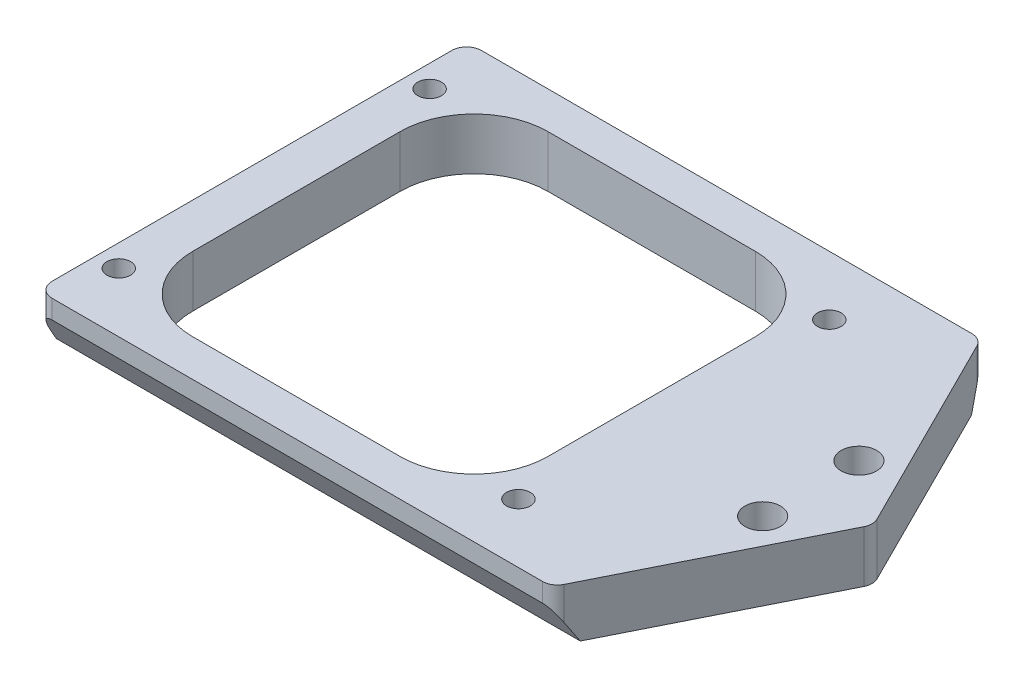
ISO-10303-21;
HEADER;
FILE_DESCRIPTION(('STEP AP214'),'2;1');
FILE_NAME('part.step','',(''),(''),'','','');
FILE_SCHEMA(('AUTOMOTIVE_DESIGN { 1 0 10303 214 1 1 1 1 }'));
ENDSEC;
DATA;
#1=APPLICATION_CONTEXT('core data for automotive mechanical design processes');
#2=APPLICATION_PROTOCOL_DEFINITION('international standard','automotive_design',2000,#1);
#3=PRODUCT_CONTEXT('',#1,'mechanical');
#4=PRODUCT('Part','Part','',(#3));
#5=PRODUCT_RELATED_PRODUCT_CATEGORY('part','',(#4));
#6=PRODUCT_DEFINITION_FORMATION('','',#4);
#7=PRODUCT_DEFINITION_CONTEXT('part definition',#1,'design');
#8=PRODUCT_DEFINITION('design','',#6,#7);
#9=PRODUCT_DEFINITION_SHAPE('','',#8);
#10=(LENGTH_UNIT() NAMED_UNIT(*) SI_UNIT(.MILLI.,.METRE.));
#11=(NAMED_UNIT(*) PLANE_ANGLE_UNIT() SI_UNIT($,.RADIAN.));
#12=(NAMED_UNIT(*) SI_UNIT($,.STERADIAN.) SOLID_ANGLE_UNIT());
#13=UNCERTAINTY_MEASURE_WITH_UNIT(LENGTH_MEASURE(1.E-05),#10,'distance_accuracy_value','');
#14=(GEOMETRIC_REPRESENTATION_CONTEXT(3) GLOBAL_UNCERTAINTY_ASSIGNED_CONTEXT((#13)) GLOBAL_UNIT_ASSIGNED_CONTEXT((#10,
#11,#12)) REPRESENTATION_CONTEXT('',''));
#15=CARTESIAN_POINT('',(0.,0.,0.));
#16=DIRECTION('',(0.,0.,1.));
#17=DIRECTION('',(1.,0.,0.));
#18=AXIS2_PLACEMENT_3D('',#15,#16,#17);
#19=CARTESIAN_POINT('',(0.,1.75,0.));
#20=DIRECTION('',(0.,-1.,0.));
#21=DIRECTION('',(0.,0.,-1.));
#22=AXIS2_PLACEMENT_3D('',#19,#20,#21);
#23=PLANE('',#22);
#24=CARTESIAN_POINT('',(37.7484344171534,1.75,-17.75));
#25=DIRECTION('',(0.,1.,0.));
#26=DIRECTION('',(0.,0.,1.));
#27=AXIS2_PLACEMENT_3D('',#24,#25,#26);
#28=CIRCLE('',#27,1.2);
#29=CARTESIAN_POINT('',(37.7484344171534,1.75,-16.55));
#30=VERTEX_POINT('',#29);
#31=EDGE_CURVE('E562',#30,#30,#28,.T.);
#32=ORIENTED_EDGE('',*,*,#31,.F.);
#33=EDGE_LOOP('',(#32));
#34=FACE_BOUND('',#33,.T.);
#35=DIRECTION('',(-1.,0.,0.));
#36=VECTOR('',#35,1.);
#37=CARTESIAN_POINT('',(0.,1.75,-29.));
#38=LINE('',#37,#36);
#39=CARTESIAN_POINT('',(34.1304601092614,1.75,-29.));
#40=VERTEX_POINT('',#39);
#41=CARTESIAN_POINT('',(1.,1.75,-29.));
#42=VERTEX_POINT('',#41);
#43=EDGE_CURVE('E219',#40,#42,#38,.T.);
#44=ORIENTED_EDGE('',*,*,#43,.T.);
#45=CARTESIAN_POINT('',(1.,1.75,-28.));
#46=DIRECTION('',(0.,-1.,0.));
#47=DIRECTION('',(0.,0.,-1.));
#48=AXIS2_PLACEMENT_3D('',#45,#46,#47);
#49=CIRCLE('',#48,1.);
#50=CARTESIAN_POINT('',(0.,1.75,-28.));
#51=VERTEX_POINT('',#50);
#52=EDGE_CURVE('E305',#42,#51,#49,.F.);
#53=ORIENTED_EDGE('',*,*,#52,.T.);
#54=DIRECTION('',(0.,0.,1.));
#55=VECTOR('',#54,1.);
#56=CARTESIAN_POINT('',(0.,1.75,0.));
#57=LINE('',#56,#55);
#58=CARTESIAN_POINT('',(0.,1.75,-1.));
#59=VERTEX_POINT('',#58);
#60=EDGE_CURVE('E224',#51,#59,#57,.T.);
#61=ORIENTED_EDGE('',*,*,#60,.T.);
#62=CARTESIAN_POINT('',(1.,1.75,-1.));
#63=DIRECTION('',(0.,-1.,0.));
#64=DIRECTION('',(0.,0.,-1.));
#65=AXIS2_PLACEMENT_3D('',#62,#63,#64);
#66=CIRCLE('',#65,1.);
#67=CARTESIAN_POINT('',(1.,1.75,0.));
#68=VERTEX_POINT('',#67);
#69=EDGE_CURVE('E293',#59,#68,#66,.F.);
#70=ORIENTED_EDGE('',*,*,#69,.T.);
#71=DIRECTION('',(1.,0.,0.));
#72=VECTOR('',#71,1.);
#73=CARTESIAN_POINT('',(0.,1.75,0.));
#74=LINE('',#73,#72);
#75=CARTESIAN_POINT('',(34.1304601092614,1.75,0.));
#76=VERTEX_POINT('',#75);
#77=EDGE_CURVE('E338',#68,#76,#74,.T.);
#78=ORIENTED_EDGE('',*,*,#77,.T.);
#79=CARTESIAN_POINT('',(34.1304601092614,1.75,-1.));
#80=DIRECTION('',(0.,-1.,0.));
#81=DIRECTION('',(0.,0.,-1.));
#82=AXIS2_PLACEMENT_3D('',#79,#80,#81);
#83=CIRCLE('',#82,1.);
#84=CARTESIAN_POINT('',(35.0248486696315,1.75,-0.552709151581289));
#85=VERTEX_POINT('',#84);
#86=EDGE_CURVE('E296',#76,#85,#83,.F.);
#87=ORIENTED_EDGE('',*,*,#86,.T.);
#88=DIRECTION('',(0.447290848418714,0.,-0.894388560370081));
#89=VECTOR('',#88,1.);
#90=CARTESIAN_POINT('',(42.,1.75,-14.5));
#91=LINE('',#90,#89);
#92=CARTESIAN_POINT('',(41.7763062812472,1.75,-14.0527091515813));
#93=VERTEX_POINT('',#92);
#94=EDGE_CURVE('E342',#85,#93,#91,.T.);
#95=ORIENTED_EDGE('',*,*,#94,.T.);
#96=CARTESIAN_POINT('',(40.8819177208771,1.75,-14.5));
#97=DIRECTION('',(0.,-1.,0.));
#98=DIRECTION('',(0.,0.,-1.));
#99=AXIS2_PLACEMENT_3D('',#96,#97,#98);
#100=CIRCLE('',#99,1.);
#101=CARTESIAN_POINT('',(41.7763062812472,1.75,-14.9472908484187));
#102=VERTEX_POINT('',#101);
#103=EDGE_CURVE('E299',#93,#102,#100,.F.);
#104=ORIENTED_EDGE('',*,*,#103,.T.);
#105=DIRECTION('',(-0.447290848418716,0.,-0.894388560370081));
#106=VECTOR('',#105,1.);
#107=CARTESIAN_POINT('',(42.,1.75,-14.5));
#108=LINE('',#107,#106);
#109=CARTESIAN_POINT('',(35.0248486696314,1.75,-28.4472908484187));
#110=VERTEX_POINT('',#109);
#111=EDGE_CURVE('E347',#102,#110,#108,.T.);
#112=ORIENTED_EDGE('',*,*,#111,.T.);
#113=CARTESIAN_POINT('',(34.1304601092614,1.75,-28.));
#114=DIRECTION('',(0.,-1.,0.));
#115=DIRECTION('',(0.,0.,-1.));
#116=AXIS2_PLACEMENT_3D('',#113,#114,#115);
#117=CIRCLE('',#116,1.);
#118=EDGE_CURVE('E302',#110,#40,#117,.F.);
#119=ORIENTED_EDGE('',*,*,#118,.T.);
#120=EDGE_LOOP('',(#44,#53,#61,#70,#78,#87,#95,#104,#112,#119));
#121=FACE_BOUND('',#120,.T.);
#122=DIRECTION('',(1.,0.,0.));
#123=VECTOR('',#122,1.);
#124=CARTESIAN_POINT('',(3.,1.75,-2.5));
#125=LINE('',#124,#123);
#126=CARTESIAN_POINT('',(8.,1.75,-2.5));
#127=VERTEX_POINT('',#126);
#128=CARTESIAN_POINT('',(22.,1.75,-2.5));
#129=VERTEX_POINT('',#128);
#130=EDGE_CURVE('E422',#127,#129,#125,.T.);
#131=ORIENTED_EDGE('',*,*,#130,.F.);
#132=CARTESIAN_POINT('',(8.,1.75,-7.5));
#133=DIRECTION('',(0.,-1.,0.));
#134=DIRECTION('',(0.,0.,-1.));
#135=AXIS2_PLACEMENT_3D('',#132,#133,#134);
#136=CIRCLE('',#135,5.);
#137=CARTESIAN_POINT('',(3.,1.75,-7.50000000000001));
#138=VERTEX_POINT('',#137);
#139=EDGE_CURVE('E271',#127,#138,#136,.T.);
#140=ORIENTED_EDGE('',*,*,#139,.T.);
#141=DIRECTION('',(0.,0.,1.));
#142=VECTOR('',#141,1.);
#143=CARTESIAN_POINT('',(3.,1.75,-26.5));
#144=LINE('',#143,#142);
#145=CARTESIAN_POINT('',(3.,1.75,-21.5));
#146=VERTEX_POINT('',#145);
#147=EDGE_CURVE('E418',#146,#138,#144,.T.);
#148=ORIENTED_EDGE('',*,*,#147,.F.);
#149=CARTESIAN_POINT('',(8.,1.75,-21.5));
#150=DIRECTION('',(0.,-1.,0.));
#151=DIRECTION('',(0.,0.,-1.));
#152=AXIS2_PLACEMENT_3D('',#149,#150,#151);
#153=CIRCLE('',#152,5.);
#154=CARTESIAN_POINT('',(8.,1.75,-26.5));
#155=VERTEX_POINT('',#154);
#156=EDGE_CURVE('E253',#146,#155,#153,.T.);
#157=ORIENTED_EDGE('',*,*,#156,.T.);
#158=DIRECTION('',(-1.,0.,0.));
#159=VECTOR('',#158,1.);
#160=CARTESIAN_POINT('',(3.,1.75,-26.5));
#161=LINE('',#160,#159);
#162=CARTESIAN_POINT('',(22.,1.75,-26.5));
#163=VERTEX_POINT('',#162);
#164=EDGE_CURVE('E430',#163,#155,#161,.T.);
#165=ORIENTED_EDGE('',*,*,#164,.F.);
#166=CARTESIAN_POINT('',(22.,1.75,-21.5));
#167=DIRECTION('',(0.,-1.,0.));
#168=DIRECTION('',(0.,0.,-1.));
#169=AXIS2_PLACEMENT_3D('',#166,#167,#168);
#170=CIRCLE('',#169,5.);
#171=CARTESIAN_POINT('',(27.,1.75,-21.5));
#172=VERTEX_POINT('',#171);
#173=EDGE_CURVE('E259',#163,#172,#170,.T.);
#174=ORIENTED_EDGE('',*,*,#173,.T.);
#175=DIRECTION('',(0.,0.,-1.));
#176=VECTOR('',#175,1.);
#177=CARTESIAN_POINT('',(27.,1.75,-26.5));
#178=LINE('',#177,#176);
#179=CARTESIAN_POINT('',(27.,1.75,-7.50000000000001));
#180=VERTEX_POINT('',#179);
#181=EDGE_CURVE('E426',#180,#172,#178,.T.);
#182=ORIENTED_EDGE('',*,*,#181,.F.);
#183=CARTESIAN_POINT('',(22.,1.75,-7.5));
#184=DIRECTION('',(0.,-1.,0.));
#185=DIRECTION('',(0.,0.,-1.));
#186=AXIS2_PLACEMENT_3D('',#183,#184,#185);
#187=CIRCLE('',#186,5.);
#188=EDGE_CURVE('E265',#180,#129,#187,.T.);
#189=ORIENTED_EDGE('',*,*,#188,.T.);
#190=EDGE_LOOP('',(#131,#140,#148,#157,#165,#174,#182,#189));
#191=FACE_BOUND('',#190,.T.);
#192=CARTESIAN_POINT('',(1.5,1.75,-4.));
#193=DIRECTION('',(0.,1.,0.));
#194=DIRECTION('',(0.,0.,1.));
#195=AXIS2_PLACEMENT_3D('',#192,#193,#194);
#196=CIRCLE('',#195,0.799999999999988);
#197=CARTESIAN_POINT('',(1.5,1.75,-3.20000000000002));
#198=VERTEX_POINT('',#197);
#199=EDGE_CURVE('E410',#198,#198,#196,.T.);
#200=ORIENTED_EDGE('',*,*,#199,.F.);
#201=EDGE_LOOP('',(#200));
#202=FACE_BOUND('',#201,.T.);
#203=CARTESIAN_POINT('',(28.5,1.75,-4.00000000000001));
#204=DIRECTION('',(0.,1.,0.));
#205=DIRECTION('',(0.,0.,1.));
#206=AXIS2_PLACEMENT_3D('',#203,#204,#205);
#207=CIRCLE('',#206,0.799999999999988);
#208=CARTESIAN_POINT('',(28.5,1.75,-3.20000000000002));
#209=VERTEX_POINT('',#208);
#210=EDGE_CURVE('E402',#209,#209,#207,.T.);
#211=ORIENTED_EDGE('',*,*,#210,.F.);
#212=EDGE_LOOP('',(#211));
#213=FACE_BOUND('',#212,.T.);
#214=CARTESIAN_POINT('',(28.5,1.75,-25.));
#215=DIRECTION('',(0.,1.,0.));
#216=DIRECTION('',(0.,0.,1.));
#217=AXIS2_PLACEMENT_3D('',#214,#215,#216);
#218=CIRCLE('',#217,0.799999999999988);
#219=CARTESIAN_POINT('',(28.5,1.75,-24.2));
#220=VERTEX_POINT('',#219);
#221=EDGE_CURVE('E394',#220,#220,#218,.T.);
#222=ORIENTED_EDGE('',*,*,#221,.F.);
#223=EDGE_LOOP('',(#222));
#224=FACE_BOUND('',#223,.T.);
#225=CARTESIAN_POINT('',(1.5,1.75,-25.));
#226=DIRECTION('',(0.,1.,0.));
#227=DIRECTION('',(0.,0.,1.));
#228=AXIS2_PLACEMENT_3D('',#225,#226,#227);
#229=CIRCLE('',#228,0.799999999999988);
#230=CARTESIAN_POINT('',(1.5,1.75,-24.2));
#231=VERTEX_POINT('',#230);
#232=EDGE_CURVE('E386',#231,#231,#229,.T.);
#233=ORIENTED_EDGE('',*,*,#232,.F.);
#234=EDGE_LOOP('',(#233));
#235=FACE_BOUND('',#234,.T.);
#236=CARTESIAN_POINT('',(37.7484344171534,1.75,-11.25));
#237=DIRECTION('',(0.,1.,0.));
#238=DIRECTION('',(0.,0.,1.));
#239=AXIS2_PLACEMENT_3D('',#236,#237,#238);
#240=CIRCLE('',#239,1.2);
#241=CARTESIAN_POINT('',(37.7484344171534,1.75,-10.05));
#242=VERTEX_POINT('',#241);
#243=EDGE_CURVE('E554',#242,#242,#240,.T.);
#244=ORIENTED_EDGE('',*,*,#243,.F.);
#245=EDGE_LOOP('',(#244));
#246=FACE_BOUND('',#245,.T.);
#247=ADVANCED_FACE('F43',(#34,#121,#191,#202,#213,#224,#235,#246),#23,.F.);
#248=CARTESIAN_POINT('',(0.,1.75,0.));
#249=DIRECTION('',(1.,0.,0.));
#250=DIRECTION('',(0.,0.,-1.));
#251=AXIS2_PLACEMENT_3D('',#248,#249,#250);
#252=PLANE('',#251);
#253=DIRECTION('',(0.,-0.866025403784436,0.500000000000005));
#254=VECTOR('',#253,1.);
#255=CARTESIAN_POINT('',(0.,-1.75000000000018,-27.7128129211089));
#256=LINE('',#255,#254);
#257=CARTESIAN_POINT('',(0.,-1.25257738808342,-28.));
#258=VERTEX_POINT('',#257);
#259=CARTESIAN_POINT('',(0.,-1.75000000000018,-27.7128129211089));
#260=VERTEX_POINT('',#259);
#261=EDGE_CURVE('E181',#258,#260,#256,.T.);
#262=ORIENTED_EDGE('',*,*,#261,.T.);
#263=DIRECTION('',(0.,0.,1.));
#264=VECTOR('',#263,1.);
#265=CARTESIAN_POINT('',(0.,-1.75,0.));
#266=LINE('',#265,#264);
#267=CARTESIAN_POINT('',(0.,-1.75000000000018,-1.28718707889115));
#268=VERTEX_POINT('',#267);
#269=EDGE_CURVE('E196',#260,#268,#266,.T.);
#270=ORIENTED_EDGE('',*,*,#269,.T.);
#271=DIRECTION('',(0.,-0.866025403784436,-0.500000000000005));
#272=VECTOR('',#271,1.);
#273=CARTESIAN_POINT('',(0.,-1.75000000000018,-1.28718707889115));
#274=LINE('',#273,#272);
#275=CARTESIAN_POINT('',(0.,-1.25257738808342,-1.));
#276=VERTEX_POINT('',#275);
#277=EDGE_CURVE('E367',#276,#268,#274,.T.);
#278=ORIENTED_EDGE('',*,*,#277,.F.);
#279=DIRECTION('',(0.,-1.,0.));
#280=VECTOR('',#279,1.);
#281=CARTESIAN_POINT('',(0.,1.75,-1.));
#282=LINE('',#281,#280);
#283=EDGE_CURVE('E277',#276,#59,#282,.F.);
#284=ORIENTED_EDGE('',*,*,#283,.T.);
#285=ORIENTED_EDGE('',*,*,#60,.F.);
#286=DIRECTION('',(0.,-1.,0.));
#287=VECTOR('',#286,1.);
#288=CARTESIAN_POINT('',(0.,1.75,-28.));
#289=LINE('',#288,#287);
#290=EDGE_CURVE('E200',#51,#258,#289,.T.);
#291=ORIENTED_EDGE('',*,*,#290,.T.);
#292=EDGE_LOOP('',(#262,#270,#278,#284,#285,#291));
#293=FACE_BOUND('',#292,.T.);
#294=ADVANCED_FACE('F194',(#293),#252,.F.);
#295=CARTESIAN_POINT('',(0.,-1.75,0.));
#296=DIRECTION('',(0.,-1.,0.));
#297=DIRECTION('',(0.,0.,-1.));
#298=AXIS2_PLACEMENT_3D('',#295,#296,#297);
#299=PLANE('',#298);
#300=CARTESIAN_POINT('',(37.7484344171534,-1.75000000000018,-17.75));
#301=DIRECTION('',(0.,1.,0.));
#302=DIRECTION('',(0.,0.,1.));
#303=AXIS2_PLACEMENT_3D('',#300,#301,#302);
#304=CIRCLE('',#303,1.2);
#305=CARTESIAN_POINT('',(37.7484344171534,-1.75000000000018,-16.55));
#306=VERTEX_POINT('',#305);
#307=EDGE_CURVE('E558',#306,#306,#304,.T.);
#308=ORIENTED_EDGE('',*,*,#307,.T.);
#309=EDGE_LOOP('',(#308));
#310=FACE_BOUND('',#309,.T.);
#311=CARTESIAN_POINT('',(37.7484344171534,-1.75000000000018,-11.25));
#312=DIRECTION('',(0.,1.,0.));
#313=DIRECTION('',(0.,0.,1.));
#314=AXIS2_PLACEMENT_3D('',#311,#312,#313);
#315=CIRCLE('',#314,1.2);
#316=CARTESIAN_POINT('',(37.7484344171534,-1.75000000000018,-10.05));
#317=VERTEX_POINT('',#316);
#318=EDGE_CURVE('E190',#317,#317,#315,.T.);
#319=ORIENTED_EDGE('',*,*,#318,.T.);
#320=EDGE_LOOP('',(#319));
#321=FACE_BOUND('',#320,.T.);
#322=CARTESIAN_POINT('',(1.5,-1.75,-25.));
#323=DIRECTION('',(0.,1.,0.));
#324=DIRECTION('',(0.,0.,1.));
#325=AXIS2_PLACEMENT_3D('',#322,#323,#324);
#326=CIRCLE('',#325,0.799999999999999);
#327=CARTESIAN_POINT('',(1.5,-1.75,-24.2));
#328=VERTEX_POINT('',#327);
#329=EDGE_CURVE('E390',#328,#328,#326,.T.);
#330=ORIENTED_EDGE('',*,*,#329,.T.);
#331=EDGE_LOOP('',(#330));
#332=FACE_BOUND('',#331,.T.);
#333=CARTESIAN_POINT('',(28.5,-1.75,-25.));
#334=DIRECTION('',(0.,1.,0.));
#335=DIRECTION('',(0.,0.,1.));
#336=AXIS2_PLACEMENT_3D('',#333,#334,#335);
#337=CIRCLE('',#336,0.799999999999999);
#338=CARTESIAN_POINT('',(28.5,-1.75,-24.2));
#339=VERTEX_POINT('',#338);
#340=EDGE_CURVE('E398',#339,#339,#337,.T.);
#341=ORIENTED_EDGE('',*,*,#340,.T.);
#342=EDGE_LOOP('',(#341));
#343=FACE_BOUND('',#342,.T.);
#344=CARTESIAN_POINT('',(28.5,-1.75,-4.00000000000001));
#345=DIRECTION('',(0.,1.,0.));
#346=DIRECTION('',(0.,0.,1.));
#347=AXIS2_PLACEMENT_3D('',#344,#345,#346);
#348=CIRCLE('',#347,0.799999999999999);
#349=CARTESIAN_POINT('',(28.5,-1.75,-3.20000000000001));
#350=VERTEX_POINT('',#349);
#351=EDGE_CURVE('E406',#350,#350,#348,.T.);
#352=ORIENTED_EDGE('',*,*,#351,.T.);
#353=EDGE_LOOP('',(#352));
#354=FACE_BOUND('',#353,.T.);
#355=CARTESIAN_POINT('',(1.5,-1.75,-4.));
#356=DIRECTION('',(0.,1.,0.));
#357=DIRECTION('',(0.,0.,1.));
#358=AXIS2_PLACEMENT_3D('',#355,#356,#357);
#359=CIRCLE('',#358,0.799999999999999);
#360=CARTESIAN_POINT('',(1.5,-1.75,-3.20000000000001));
#361=VERTEX_POINT('',#360);
#362=EDGE_CURVE('E414',#361,#361,#359,.T.);
#363=ORIENTED_EDGE('',*,*,#362,.T.);
#364=EDGE_LOOP('',(#363));
#365=FACE_BOUND('',#364,.T.);
#366=DIRECTION('',(-1.,0.,0.));
#367=VECTOR('',#366,1.);
#368=CARTESIAN_POINT('',(3.,-1.75,-26.5));
#369=LINE('',#368,#367);
#370=CARTESIAN_POINT('',(22.,-1.75,-26.5));
#371=VERTEX_POINT('',#370);
#372=CARTESIAN_POINT('',(8.,-1.75,-26.5));
#373=VERTEX_POINT('',#372);
#374=EDGE_CURVE('E209',#371,#373,#369,.T.);
#375=ORIENTED_EDGE('',*,*,#374,.T.);
#376=CARTESIAN_POINT('',(8.,-1.75,-21.5));
#377=DIRECTION('',(0.,-1.,0.));
#378=DIRECTION('',(0.,0.,-1.));
#379=AXIS2_PLACEMENT_3D('',#376,#377,#378);
#380=CIRCLE('',#379,5.);
#381=CARTESIAN_POINT('',(3.,-1.75,-21.5));
#382=VERTEX_POINT('',#381);
#383=EDGE_CURVE('E256',#373,#382,#380,.F.);
#384=ORIENTED_EDGE('',*,*,#383,.T.);
#385=DIRECTION('',(0.,0.,1.));
#386=VECTOR('',#385,1.);
#387=CARTESIAN_POINT('',(3.,-1.75,-26.5));
#388=LINE('',#387,#386);
#389=CARTESIAN_POINT('',(3.,-1.75,-7.50000000000001));
#390=VERTEX_POINT('',#389);
#391=EDGE_CURVE('E434',#382,#390,#388,.T.);
#392=ORIENTED_EDGE('',*,*,#391,.T.);
#393=CARTESIAN_POINT('',(8.,-1.75,-7.5));
#394=DIRECTION('',(0.,-1.,0.));
#395=DIRECTION('',(0.,0.,-1.));
#396=AXIS2_PLACEMENT_3D('',#393,#394,#395);
#397=CIRCLE('',#396,5.);
#398=CARTESIAN_POINT('',(8.,-1.75,-2.5));
#399=VERTEX_POINT('',#398);
#400=EDGE_CURVE('E274',#390,#399,#397,.F.);
#401=ORIENTED_EDGE('',*,*,#400,.T.);
#402=DIRECTION('',(1.,0.,0.));
#403=VECTOR('',#402,1.);
#404=CARTESIAN_POINT('',(3.,-1.75,-2.5));
#405=LINE('',#404,#403);
#406=CARTESIAN_POINT('',(22.,-1.75,-2.5));
#407=VERTEX_POINT('',#406);
#408=EDGE_CURVE('E438',#399,#407,#405,.T.);
#409=ORIENTED_EDGE('',*,*,#408,.T.);
#410=CARTESIAN_POINT('',(22.,-1.75,-7.5));
#411=DIRECTION('',(0.,-1.,0.));
#412=DIRECTION('',(0.,0.,-1.));
#413=AXIS2_PLACEMENT_3D('',#410,#411,#412);
#414=CIRCLE('',#413,5.);
#415=CARTESIAN_POINT('',(27.,-1.75,-7.50000000000001));
#416=VERTEX_POINT('',#415);
#417=EDGE_CURVE('E268',#407,#416,#414,.F.);
#418=ORIENTED_EDGE('',*,*,#417,.T.);
#419=DIRECTION('',(0.,0.,-1.));
#420=VECTOR('',#419,1.);
#421=CARTESIAN_POINT('',(27.,-1.75,-26.5));
#422=LINE('',#421,#420);
#423=CARTESIAN_POINT('',(27.,-1.75,-21.5));
#424=VERTEX_POINT('',#423);
#425=EDGE_CURVE('E216',#416,#424,#422,.T.);
#426=ORIENTED_EDGE('',*,*,#425,.T.);
#427=CARTESIAN_POINT('',(22.,-1.75,-21.5));
#428=DIRECTION('',(0.,-1.,0.));
#429=DIRECTION('',(0.,0.,-1.));
#430=AXIS2_PLACEMENT_3D('',#427,#428,#429);
#431=CIRCLE('',#430,5.);
#432=EDGE_CURVE('E262',#424,#371,#431,.F.);
#433=ORIENTED_EDGE('',*,*,#432,.T.);
#434=EDGE_LOOP('',(#375,#384,#392,#401,#409,#418,#426,#433));
#435=FACE_BOUND('',#434,.T.);
#436=ORIENTED_EDGE('',*,*,#269,.F.);
#437=DIRECTION('',(1.,0.,0.));
#438=VECTOR('',#437,1.);
#439=CARTESIAN_POINT('',(39.1539644536348,-1.75,-27.7128129211085));
#440=LINE('',#439,#438);
#441=CARTESIAN_POINT('',(35.3921669357723,-1.75000000000002,-27.7128129211086));
#442=VERTEX_POINT('',#441);
#443=EDGE_CURVE('E178',#260,#442,#440,.T.);
#444=ORIENTED_EDGE('',*,*,#443,.T.);
#445=DIRECTION('',(-0.447290848418716,0.,-0.894388560370081));
#446=VECTOR('',#445,1.);
#447=CARTESIAN_POINT('',(42.,-1.75,-14.5));
#448=LINE('',#447,#446);
#449=CARTESIAN_POINT('',(41.7763062812472,-1.75,-14.9472908484187));
#450=VERTEX_POINT('',#449);
#451=EDGE_CURVE('E213',#450,#442,#448,.T.);
#452=ORIENTED_EDGE('',*,*,#451,.F.);
#453=CARTESIAN_POINT('',(40.8819177208771,-1.75,-14.5));
#454=DIRECTION('',(0.,-1.,0.));
#455=DIRECTION('',(0.,0.,-1.));
#456=AXIS2_PLACEMENT_3D('',#453,#454,#455);
#457=CIRCLE('',#456,1.);
#458=CARTESIAN_POINT('',(41.7763062812472,-1.75,-14.0527091515813));
#459=VERTEX_POINT('',#458);
#460=EDGE_CURVE('E282',#450,#459,#457,.T.);
#461=ORIENTED_EDGE('',*,*,#460,.T.);
#462=DIRECTION('',(0.447290848418714,0.,-0.894388560370081));
#463=VECTOR('',#462,1.);
#464=CARTESIAN_POINT('',(42.,-1.75,-14.5));
#465=LINE('',#464,#463);
#466=CARTESIAN_POINT('',(35.3921669357723,-1.75000000000002,-1.28718707889143));
#467=VERTEX_POINT('',#466);
#468=EDGE_CURVE('E208',#467,#459,#465,.T.);
#469=ORIENTED_EDGE('',*,*,#468,.F.);
#470=DIRECTION('',(1.,0.,0.));
#471=VECTOR('',#470,1.);
#472=CARTESIAN_POINT('',(39.1539644536348,-1.75,-1.28718707889146));
#473=LINE('',#472,#471);
#474=EDGE_CURVE('E206',#268,#467,#473,.T.);
#475=ORIENTED_EDGE('',*,*,#474,.F.);
#476=EDGE_LOOP('',(#436,#444,#452,#461,#469,#475));
#477=FACE_BOUND('',#476,.T.);
#478=ADVANCED_FACE('F204',(#310,#321,#332,#343,#354,#365,#435,#477),#299,.T.);
#479=CARTESIAN_POINT('',(42.,1.75,-14.5));
#480=DIRECTION('',(-0.894388560370081,0.,0.447290848418716));
#481=DIRECTION('',(0.447290848418716,0.,0.894388560370081));
#482=AXIS2_PLACEMENT_3D('',#479,#480,#481);
#483=PLANE('',#482);
#484=DIRECTION('',(0.242584917028739,-0.840157377235131,0.485065087908361));
#485=VECTOR('',#484,1.);
#486=CARTESIAN_POINT('',(36.6224324796576,-6.01084476031521,-25.2528130517653));
#487=LINE('',#486,#485);
#488=CARTESIAN_POINT('',(35.0248486696314,-0.477846912860995,-28.4472908484187));
#489=VERTEX_POINT('',#488);
#490=EDGE_CURVE('E184',#489,#442,#487,.T.);
#491=ORIENTED_EDGE('',*,*,#490,.F.);
#492=DIRECTION('',(0.,-1.,0.));
#493=VECTOR('',#492,1.);
#494=CARTESIAN_POINT('',(35.0248486696314,1.75,-28.4472908484187));
#495=LINE('',#494,#493);
#496=EDGE_CURVE('E312',#489,#110,#495,.F.);
#497=ORIENTED_EDGE('',*,*,#496,.T.);
#498=ORIENTED_EDGE('',*,*,#111,.F.);
#499=DIRECTION('',(0.,-1.,0.));
#500=VECTOR('',#499,1.);
#501=CARTESIAN_POINT('',(41.7763062812472,1.75,-14.9472908484187));
#502=LINE('',#501,#500);
#503=EDGE_CURVE('E308',#102,#450,#502,.T.);
#504=ORIENTED_EDGE('',*,*,#503,.T.);
#505=ORIENTED_EDGE('',*,*,#451,.T.);
#506=EDGE_LOOP('',(#491,#497,#498,#504,#505));
#507=FACE_BOUND('',#506,.T.);
#508=ADVANCED_FACE('F502',(#507),#483,.F.);
#509=CARTESIAN_POINT('',(0.,1.75,-29.));
#510=DIRECTION('',(0.,0.,1.));
#511=DIRECTION('',(1.,0.,0.));
#512=AXIS2_PLACEMENT_3D('',#509,#510,#511);
#513=PLANE('',#512);
#514=DIRECTION('',(1.,0.,0.));
#515=VECTOR('',#514,1.);
#516=CARTESIAN_POINT('',(0.,0.479473419485434,-29.));
#517=LINE('',#516,#515);
#518=CARTESIAN_POINT('',(1.,0.479473419485452,-29.));
#519=VERTEX_POINT('',#518);
#520=CARTESIAN_POINT('',(34.1304601092614,0.479473419486056,-29.));
#521=VERTEX_POINT('',#520);
#522=EDGE_CURVE('E59',#519,#521,#517,.T.);
#523=ORIENTED_EDGE('',*,*,#522,.F.);
#524=DIRECTION('',(0.,-1.,0.));
#525=VECTOR('',#524,1.);
#526=CARTESIAN_POINT('',(1.,1.75,-29.));
#527=LINE('',#526,#525);
#528=EDGE_CURVE('E290',#519,#42,#527,.F.);
#529=ORIENTED_EDGE('',*,*,#528,.T.);
#530=ORIENTED_EDGE('',*,*,#43,.F.);
#531=DIRECTION('',(0.,-1.,0.));
#532=VECTOR('',#531,1.);
#533=CARTESIAN_POINT('',(34.1304601092614,1.75,-29.));
#534=LINE('',#533,#532);
#535=EDGE_CURVE('E286',#40,#521,#534,.T.);
#536=ORIENTED_EDGE('',*,*,#535,.T.);
#537=EDGE_LOOP('',(#523,#529,#530,#536));
#538=FACE_BOUND('',#537,.T.);
#539=ADVANCED_FACE('F504',(#538),#513,.F.);
#540=CARTESIAN_POINT('',(1.,1.75,-28.));
#541=DIRECTION('',(0.,-1.,0.));
#542=DIRECTION('',(0.,0.,-1.));
#543=AXIS2_PLACEMENT_3D('',#540,#541,#542);
#544=CYLINDRICAL_SURFACE('',#543,1.);
#545=ORIENTED_EDGE('',*,*,#528,.F.);
#546=CARTESIAN_POINT('',(1.,-1.25257738808341,-28.));
#547=DIRECTION('',(0.,-0.500000000000005,-0.866025403784436));
#548=DIRECTION('',(0.,-0.866025403784436,0.500000000000005));
#549=AXIS2_PLACEMENT_3D('',#546,#547,#548);
#550=ELLIPSE('',#549,1.99999999999998,1.);
#551=EDGE_CURVE('E365',#519,#258,#550,.F.);
#552=ORIENTED_EDGE('',*,*,#551,.T.);
#553=ORIENTED_EDGE('',*,*,#290,.F.);
#554=ORIENTED_EDGE('',*,*,#52,.F.);
#555=EDGE_LOOP('',(#545,#552,#553,#554));
#556=FACE_BOUND('',#555,.T.);
#557=ADVANCED_FACE('F364',(#556),#544,.T.);
#558=CARTESIAN_POINT('',(34.1304601092614,1.75,-28.));
#559=DIRECTION('',(0.,-1.,0.));
#560=DIRECTION('',(0.,0.,-1.));
#561=AXIS2_PLACEMENT_3D('',#558,#559,#560);
#562=CYLINDRICAL_SURFACE('',#561,1.);
#563=ORIENTED_EDGE('',*,*,#496,.F.);
#564=CARTESIAN_POINT('',(34.1304601092614,-1.2525773880828,-28.));
#565=DIRECTION('',(0.,-0.500000000000005,-0.866025403784436));
#566=DIRECTION('',(0.,-0.866025403784436,0.500000000000005));
#567=AXIS2_PLACEMENT_3D('',#564,#565,#566);
#568=ELLIPSE('',#567,1.99999999999998,1.);
#569=EDGE_CURVE('E11',#489,#521,#568,.F.);
#570=ORIENTED_EDGE('',*,*,#569,.T.);
#571=ORIENTED_EDGE('',*,*,#535,.F.);
#572=ORIENTED_EDGE('',*,*,#118,.F.);
#573=EDGE_LOOP('',(#563,#570,#571,#572));
#574=FACE_BOUND('',#573,.T.);
#575=ADVANCED_FACE('F516',(#574),#562,.T.);
#576=CARTESIAN_POINT('',(0.,1.75,0.));
#577=DIRECTION('',(0.,0.,-1.));
#578=DIRECTION('',(-1.,0.,0.));
#579=AXIS2_PLACEMENT_3D('',#576,#577,#578);
#580=PLANE('',#579);
#581=DIRECTION('',(-1.,0.,0.));
#582=VECTOR('',#581,1.);
#583=CARTESIAN_POINT('',(0.,0.479473419485436,0.));
#584=LINE('',#583,#582);
#585=CARTESIAN_POINT('',(34.1304601092614,0.479473419486058,0.));
#586=VERTEX_POINT('',#585);
#587=CARTESIAN_POINT('',(1.,0.479473419485455,0.));
#588=VERTEX_POINT('',#587);
#589=EDGE_CURVE('E66',#586,#588,#584,.T.);
#590=ORIENTED_EDGE('',*,*,#589,.F.);
#591=DIRECTION('',(0.,-1.,0.));
#592=VECTOR('',#591,1.);
#593=CARTESIAN_POINT('',(34.1304601092614,1.75,0.));
#594=LINE('',#593,#592);
#595=EDGE_CURVE('E326',#586,#76,#594,.F.);
#596=ORIENTED_EDGE('',*,*,#595,.T.);
#597=ORIENTED_EDGE('',*,*,#77,.F.);
#598=DIRECTION('',(0.,-1.,0.));
#599=VECTOR('',#598,1.);
#600=CARTESIAN_POINT('',(1.,1.75,0.));
#601=LINE('',#600,#599);
#602=EDGE_CURVE('E322',#68,#588,#601,.T.);
#603=ORIENTED_EDGE('',*,*,#602,.T.);
#604=EDGE_LOOP('',(#590,#596,#597,#603));
#605=FACE_BOUND('',#604,.T.);
#606=ADVANCED_FACE('F335',(#605),#580,.F.);
#607=CARTESIAN_POINT('',(42.,1.75,-14.5));
#608=DIRECTION('',(-0.894388560370081,0.,-0.447290848418714));
#609=DIRECTION('',(-0.447290848418714,0.,0.894388560370082));
#610=AXIS2_PLACEMENT_3D('',#607,#608,#609);
#611=PLANE('',#610);
#612=DIRECTION('',(-0.242584917028739,0.840157377235131,0.485065087908361));
#613=VECTOR('',#612,1.);
#614=CARTESIAN_POINT('',(36.6224324796576,-6.01084476031521,-3.74718694823466));
#615=LINE('',#614,#613);
#616=CARTESIAN_POINT('',(35.0248486696315,-0.477846912860995,-0.552709151581289));
#617=VERTEX_POINT('',#616);
#618=EDGE_CURVE('E383',#467,#617,#615,.T.);
#619=ORIENTED_EDGE('',*,*,#618,.F.);
#620=ORIENTED_EDGE('',*,*,#468,.T.);
#621=DIRECTION('',(0.,-1.,0.));
#622=VECTOR('',#621,1.);
#623=CARTESIAN_POINT('',(41.7763062812472,1.75,-14.0527091515813));
#624=LINE('',#623,#622);
#625=EDGE_CURVE('E319',#459,#93,#624,.F.);
#626=ORIENTED_EDGE('',*,*,#625,.T.);
#627=ORIENTED_EDGE('',*,*,#94,.F.);
#628=DIRECTION('',(0.,-1.,0.));
#629=VECTOR('',#628,1.);
#630=CARTESIAN_POINT('',(35.0248486696315,1.75,-0.552709151581289));
#631=LINE('',#630,#629);
#632=EDGE_CURVE('E315',#85,#617,#631,.T.);
#633=ORIENTED_EDGE('',*,*,#632,.T.);
#634=EDGE_LOOP('',(#619,#620,#626,#627,#633));
#635=FACE_BOUND('',#634,.T.);
#636=ADVANCED_FACE('F510',(#635),#611,.F.);
#637=CARTESIAN_POINT('',(34.1304601092614,1.75,-1.));
#638=DIRECTION('',(0.,-1.,0.));
#639=DIRECTION('',(0.,0.,-1.));
#640=AXIS2_PLACEMENT_3D('',#637,#638,#639);
#641=CYLINDRICAL_SURFACE('',#640,1.);
#642=ORIENTED_EDGE('',*,*,#595,.F.);
#643=CARTESIAN_POINT('',(34.1304601092614,-1.2525773880828,-1.));
#644=DIRECTION('',(0.,-0.500000000000005,0.866025403784436));
#645=DIRECTION('',(0.,-0.866025403784436,-0.500000000000005));
#646=AXIS2_PLACEMENT_3D('',#643,#644,#645);
#647=ELLIPSE('',#646,1.99999999999998,1.);
#648=EDGE_CURVE('E379',#586,#617,#647,.F.);
#649=ORIENTED_EDGE('',*,*,#648,.T.);
#650=ORIENTED_EDGE('',*,*,#632,.F.);
#651=ORIENTED_EDGE('',*,*,#86,.F.);
#652=EDGE_LOOP('',(#642,#649,#650,#651));
#653=FACE_BOUND('',#652,.T.);
#654=ADVANCED_FACE('F513',(#653),#641,.T.);
#655=CARTESIAN_POINT('',(1.,1.75,-1.));
#656=DIRECTION('',(0.,-1.,0.));
#657=DIRECTION('',(0.,0.,-1.));
#658=AXIS2_PLACEMENT_3D('',#655,#656,#657);
#659=CYLINDRICAL_SURFACE('',#658,1.);
#660=ORIENTED_EDGE('',*,*,#283,.F.);
#661=CARTESIAN_POINT('',(1.,-1.2525773880834,-1.));
#662=DIRECTION('',(0.,-0.500000000000005,0.866025403784436));
#663=DIRECTION('',(0.,-0.866025403784436,-0.500000000000005));
#664=AXIS2_PLACEMENT_3D('',#661,#662,#663);
#665=ELLIPSE('',#664,1.99999999999998,1.);
#666=EDGE_CURVE('E52',#276,#588,#665,.F.);
#667=ORIENTED_EDGE('',*,*,#666,.T.);
#668=ORIENTED_EDGE('',*,*,#602,.F.);
#669=ORIENTED_EDGE('',*,*,#69,.F.);
#670=EDGE_LOOP('',(#660,#667,#668,#669));
#671=FACE_BOUND('',#670,.T.);
#672=ADVANCED_FACE('F45',(#671),#659,.T.);
#673=CARTESIAN_POINT('',(3.,-1.75,-26.5));
#674=DIRECTION('',(-1.,0.,0.));
#675=DIRECTION('',(0.,0.,1.));
#676=AXIS2_PLACEMENT_3D('',#673,#674,#675);
#677=PLANE('',#676);
#678=ORIENTED_EDGE('',*,*,#391,.F.);
#679=DIRECTION('',(0.,1.,0.));
#680=VECTOR('',#679,1.);
#681=CARTESIAN_POINT('',(3.,1.75,-21.5));
#682=LINE('',#681,#680);
#683=EDGE_CURVE('E228',#382,#146,#682,.T.);
#684=ORIENTED_EDGE('',*,*,#683,.T.);
#685=ORIENTED_EDGE('',*,*,#147,.T.);
#686=DIRECTION('',(0.,1.,0.));
#687=VECTOR('',#686,1.);
#688=CARTESIAN_POINT('',(3.,-1.75,-7.5));
#689=LINE('',#688,#687);
#690=EDGE_CURVE('E225',#138,#390,#689,.F.);
#691=ORIENTED_EDGE('',*,*,#690,.T.);
#692=EDGE_LOOP('',(#678,#684,#685,#691));
#693=FACE_BOUND('',#692,.T.);
#694=ADVANCED_FACE('F469',(#693),#677,.F.);
#695=CARTESIAN_POINT('',(3.,-1.75,-26.5));
#696=DIRECTION('',(0.,0.,-1.));
#697=DIRECTION('',(-1.,0.,0.));
#698=AXIS2_PLACEMENT_3D('',#695,#696,#697);
#699=PLANE('',#698);
#700=ORIENTED_EDGE('',*,*,#164,.T.);
#701=DIRECTION('',(0.,1.,0.));
#702=VECTOR('',#701,1.);
#703=CARTESIAN_POINT('',(8.,-1.75,-26.5));
#704=LINE('',#703,#702);
#705=EDGE_CURVE('E236',#155,#373,#704,.F.);
#706=ORIENTED_EDGE('',*,*,#705,.T.);
#707=ORIENTED_EDGE('',*,*,#374,.F.);
#708=DIRECTION('',(0.,1.,0.));
#709=VECTOR('',#708,1.);
#710=CARTESIAN_POINT('',(22.,1.75,-26.5));
#711=LINE('',#710,#709);
#712=EDGE_CURVE('E232',#371,#163,#711,.T.);
#713=ORIENTED_EDGE('',*,*,#712,.T.);
#714=EDGE_LOOP('',(#700,#706,#707,#713));
#715=FACE_BOUND('',#714,.T.);
#716=ADVANCED_FACE('F457',(#715),#699,.F.);
#717=CARTESIAN_POINT('',(27.,-1.75,-26.5));
#718=DIRECTION('',(1.,0.,0.));
#719=DIRECTION('',(0.,0.,-1.));
#720=AXIS2_PLACEMENT_3D('',#717,#718,#719);
#721=PLANE('',#720);
#722=ORIENTED_EDGE('',*,*,#181,.T.);
#723=DIRECTION('',(0.,1.,0.));
#724=VECTOR('',#723,1.);
#725=CARTESIAN_POINT('',(27.,-1.75,-21.5));
#726=LINE('',#725,#724);
#727=EDGE_CURVE('E243',#172,#424,#726,.F.);
#728=ORIENTED_EDGE('',*,*,#727,.T.);
#729=ORIENTED_EDGE('',*,*,#425,.F.);
#730=DIRECTION('',(0.,1.,0.));
#731=VECTOR('',#730,1.);
#732=CARTESIAN_POINT('',(27.,1.75,-7.5));
#733=LINE('',#732,#731);
#734=EDGE_CURVE('E239',#416,#180,#733,.T.);
#735=ORIENTED_EDGE('',*,*,#734,.T.);
#736=EDGE_LOOP('',(#722,#728,#729,#735));
#737=FACE_BOUND('',#736,.T.);
#738=ADVANCED_FACE('F481',(#737),#721,.F.);
#739=CARTESIAN_POINT('',(3.,-1.75,-2.5));
#740=DIRECTION('',(0.,0.,1.));
#741=DIRECTION('',(1.,0.,0.));
#742=AXIS2_PLACEMENT_3D('',#739,#740,#741);
#743=PLANE('',#742);
#744=ORIENTED_EDGE('',*,*,#130,.T.);
#745=DIRECTION('',(0.,1.,0.));
#746=VECTOR('',#745,1.);
#747=CARTESIAN_POINT('',(22.,-1.75,-2.5));
#748=LINE('',#747,#746);
#749=EDGE_CURVE('E250',#129,#407,#748,.F.);
#750=ORIENTED_EDGE('',*,*,#749,.T.);
#751=ORIENTED_EDGE('',*,*,#408,.F.);
#752=DIRECTION('',(0.,1.,0.));
#753=VECTOR('',#752,1.);
#754=CARTESIAN_POINT('',(8.,1.75,-2.5));
#755=LINE('',#754,#753);
#756=EDGE_CURVE('E246',#399,#127,#755,.T.);
#757=ORIENTED_EDGE('',*,*,#756,.T.);
#758=EDGE_LOOP('',(#744,#750,#751,#757));
#759=FACE_BOUND('',#758,.T.);
#760=ADVANCED_FACE('F477',(#759),#743,.F.);
#761=CARTESIAN_POINT('',(8.,-1.75,-21.5));
#762=DIRECTION('',(0.,-1.,0.));
#763=DIRECTION('',(0.,0.,-1.));
#764=AXIS2_PLACEMENT_3D('',#761,#762,#763);
#765=CYLINDRICAL_SURFACE('',#764,5.);
#766=ORIENTED_EDGE('',*,*,#383,.F.);
#767=ORIENTED_EDGE('',*,*,#705,.F.);
#768=ORIENTED_EDGE('',*,*,#156,.F.);
#769=ORIENTED_EDGE('',*,*,#683,.F.);
#770=EDGE_LOOP('',(#766,#767,#768,#769));
#771=FACE_BOUND('',#770,.T.);
#772=ADVANCED_FACE('F466',(#771),#765,.F.);
#773=CARTESIAN_POINT('',(22.,-1.75,-21.5));
#774=DIRECTION('',(0.,-1.,0.));
#775=DIRECTION('',(0.,0.,-1.));
#776=AXIS2_PLACEMENT_3D('',#773,#774,#775);
#777=CYLINDRICAL_SURFACE('',#776,5.);
#778=ORIENTED_EDGE('',*,*,#432,.F.);
#779=ORIENTED_EDGE('',*,*,#727,.F.);
#780=ORIENTED_EDGE('',*,*,#173,.F.);
#781=ORIENTED_EDGE('',*,*,#712,.F.);
#782=EDGE_LOOP('',(#778,#779,#780,#781));
#783=FACE_BOUND('',#782,.T.);
#784=ADVANCED_FACE('F454',(#783),#777,.F.);
#785=CARTESIAN_POINT('',(22.,-1.75,-7.5));
#786=DIRECTION('',(0.,-1.,0.));
#787=DIRECTION('',(0.,0.,-1.));
#788=AXIS2_PLACEMENT_3D('',#785,#786,#787);
#789=CYLINDRICAL_SURFACE('',#788,5.);
#790=ORIENTED_EDGE('',*,*,#417,.F.);
#791=ORIENTED_EDGE('',*,*,#749,.F.);
#792=ORIENTED_EDGE('',*,*,#188,.F.);
#793=ORIENTED_EDGE('',*,*,#734,.F.);
#794=EDGE_LOOP('',(#790,#791,#792,#793));
#795=FACE_BOUND('',#794,.T.);
#796=ADVANCED_FACE('F480',(#795),#789,.F.);
#797=CARTESIAN_POINT('',(8.,-1.75,-7.5));
#798=DIRECTION('',(0.,-1.,0.));
#799=DIRECTION('',(0.,0.,-1.));
#800=AXIS2_PLACEMENT_3D('',#797,#798,#799);
#801=CYLINDRICAL_SURFACE('',#800,5.);
#802=ORIENTED_EDGE('',*,*,#400,.F.);
#803=ORIENTED_EDGE('',*,*,#690,.F.);
#804=ORIENTED_EDGE('',*,*,#139,.F.);
#805=ORIENTED_EDGE('',*,*,#756,.F.);
#806=EDGE_LOOP('',(#802,#803,#804,#805));
#807=FACE_BOUND('',#806,.T.);
#808=ADVANCED_FACE('F475',(#807),#801,.F.);
#809=CARTESIAN_POINT('',(1.5,1.75,-4.));
#810=DIRECTION('',(0.,1.,0.));
#811=DIRECTION('',(0.,0.,1.));
#812=AXIS2_PLACEMENT_3D('',#809,#810,#811);
#813=CYLINDRICAL_SURFACE('',#812,0.799999999999994);
#814=ORIENTED_EDGE('',*,*,#362,.F.);
#815=EDGE_LOOP('',(#814));
#816=FACE_BOUND('',#815,.T.);
#817=ORIENTED_EDGE('',*,*,#199,.T.);
#818=EDGE_LOOP('',(#817));
#819=FACE_BOUND('',#818,.T.);
#820=ADVANCED_FACE('F526',(#816,#819),#813,.F.);
#821=CARTESIAN_POINT('',(28.5,1.75,-4.00000000000001));
#822=DIRECTION('',(0.,1.,0.));
#823=DIRECTION('',(0.,0.,1.));
#824=AXIS2_PLACEMENT_3D('',#821,#822,#823);
#825=CYLINDRICAL_SURFACE('',#824,0.799999999999993);
#826=ORIENTED_EDGE('',*,*,#351,.F.);
#827=EDGE_LOOP('',(#826));
#828=FACE_BOUND('',#827,.T.);
#829=ORIENTED_EDGE('',*,*,#210,.T.);
#830=EDGE_LOOP('',(#829));
#831=FACE_BOUND('',#830,.T.);
#832=ADVANCED_FACE('F588',(#828,#831),#825,.F.);
#833=CARTESIAN_POINT('',(28.5,1.75,-25.));
#834=DIRECTION('',(0.,1.,0.));
#835=DIRECTION('',(0.,0.,1.));
#836=AXIS2_PLACEMENT_3D('',#833,#834,#835);
#837=CYLINDRICAL_SURFACE('',#836,0.799999999999993);
#838=ORIENTED_EDGE('',*,*,#340,.F.);
#839=EDGE_LOOP('',(#838));
#840=FACE_BOUND('',#839,.T.);
#841=ORIENTED_EDGE('',*,*,#221,.T.);
#842=EDGE_LOOP('',(#841));
#843=FACE_BOUND('',#842,.T.);
#844=ADVANCED_FACE('F584',(#840,#843),#837,.F.);
#845=CARTESIAN_POINT('',(1.5,1.75,-25.));
#846=DIRECTION('',(0.,1.,0.));
#847=DIRECTION('',(0.,0.,1.));
#848=AXIS2_PLACEMENT_3D('',#845,#846,#847);
#849=CYLINDRICAL_SURFACE('',#848,0.799999999999994);
#850=ORIENTED_EDGE('',*,*,#329,.F.);
#851=EDGE_LOOP('',(#850));
#852=FACE_BOUND('',#851,.T.);
#853=ORIENTED_EDGE('',*,*,#232,.T.);
#854=EDGE_LOOP('',(#853));
#855=FACE_BOUND('',#854,.T.);
#856=ADVANCED_FACE('F535',(#852,#855),#849,.F.);
#857=CARTESIAN_POINT('',(40.8819177208771,1.75,-14.5));
#858=DIRECTION('',(0.,-1.,0.));
#859=DIRECTION('',(0.,0.,-1.));
#860=AXIS2_PLACEMENT_3D('',#857,#858,#859);
#861=CYLINDRICAL_SURFACE('',#860,1.);
#862=ORIENTED_EDGE('',*,*,#103,.F.);
#863=ORIENTED_EDGE('',*,*,#625,.F.);
#864=ORIENTED_EDGE('',*,*,#460,.F.);
#865=ORIENTED_EDGE('',*,*,#503,.F.);
#866=EDGE_LOOP('',(#862,#863,#864,#865));
#867=FACE_BOUND('',#866,.T.);
#868=ADVANCED_FACE('F532',(#867),#861,.T.);
#869=CARTESIAN_POINT('',(0.,0.119868354871361,-0.207618080856892));
#870=DIRECTION('',(0.,-0.500000000000005,0.866025403784436));
#871=DIRECTION('',(0.,-0.866025403784436,-0.500000000000005));
#872=AXIS2_PLACEMENT_3D('',#869,#870,#871);
#873=PLANE('',#872);
#874=ORIENTED_EDGE('',*,*,#618,.T.);
#875=ORIENTED_EDGE('',*,*,#648,.F.);
#876=ORIENTED_EDGE('',*,*,#589,.T.);
#877=ORIENTED_EDGE('',*,*,#666,.F.);
#878=ORIENTED_EDGE('',*,*,#277,.T.);
#879=ORIENTED_EDGE('',*,*,#474,.T.);
#880=EDGE_LOOP('',(#874,#875,#876,#877,#878,#879));
#881=FACE_BOUND('',#880,.T.);
#882=ADVANCED_FACE('F534',(#881),#873,.T.);
#883=CARTESIAN_POINT('',(0.,0.119868354871361,-28.7923819191431));
#884=DIRECTION('',(0.,-0.500000000000005,-0.866025403784436));
#885=DIRECTION('',(0.,-0.866025403784436,0.500000000000005));
#886=AXIS2_PLACEMENT_3D('',#883,#884,#885);
#887=PLANE('',#886);
#888=ORIENTED_EDGE('',*,*,#522,.T.);
#889=ORIENTED_EDGE('',*,*,#569,.F.);
#890=ORIENTED_EDGE('',*,*,#490,.T.);
#891=ORIENTED_EDGE('',*,*,#443,.F.);
#892=ORIENTED_EDGE('',*,*,#261,.F.);
#893=ORIENTED_EDGE('',*,*,#551,.F.);
#894=EDGE_LOOP('',(#888,#889,#890,#891,#892,#893));
#895=FACE_BOUND('',#894,.T.);
#896=ADVANCED_FACE('F180',(#895),#887,.T.);
#897=CARTESIAN_POINT('',(37.7484344171534,1.75,-11.25));
#898=DIRECTION('',(0.,1.,0.));
#899=DIRECTION('',(0.,0.,1.));
#900=AXIS2_PLACEMENT_3D('',#897,#898,#899);
#901=CYLINDRICAL_SURFACE('',#900,1.2);
#902=ORIENTED_EDGE('',*,*,#318,.F.);
#903=EDGE_LOOP('',(#902));
#904=FACE_BOUND('',#903,.T.);
#905=ORIENTED_EDGE('',*,*,#243,.T.);
#906=EDGE_LOOP('',(#905));
#907=FACE_BOUND('',#906,.T.);
#908=ADVANCED_FACE('F568',(#904,#907),#901,.F.);
#909=CARTESIAN_POINT('',(37.7484344171534,1.75,-17.75));
#910=DIRECTION('',(0.,1.,0.));
#911=DIRECTION('',(0.,0.,1.));
#912=AXIS2_PLACEMENT_3D('',#909,#910,#911);
#913=CYLINDRICAL_SURFACE('',#912,1.2);
#914=ORIENTED_EDGE('',*,*,#307,.F.);
#915=EDGE_LOOP('',(#914));
#916=FACE_BOUND('',#915,.T.);
#917=ORIENTED_EDGE('',*,*,#31,.T.);
#918=EDGE_LOOP('',(#917));
#919=FACE_BOUND('',#918,.T.);
#920=ADVANCED_FACE('F566',(#916,#919),#913,.F.);
#921=CLOSED_SHELL('',(#247,#294,#478,#508,#539,#557,#575,#606,#636,#654,#672,#694,#716,#738,
#760,#772,#784,#796,#808,#820,#832,#844,#856,#868,#882,#896,#908,#920));
#922=MANIFOLD_SOLID_BREP('B2',#921);
#923=ADVANCED_BREP_SHAPE_REPRESENTATION('',(#18,#922),#14);
#924=SHAPE_DEFINITION_REPRESENTATION(#9,#923);
ENDSEC;
END-ISO-10303-21;
